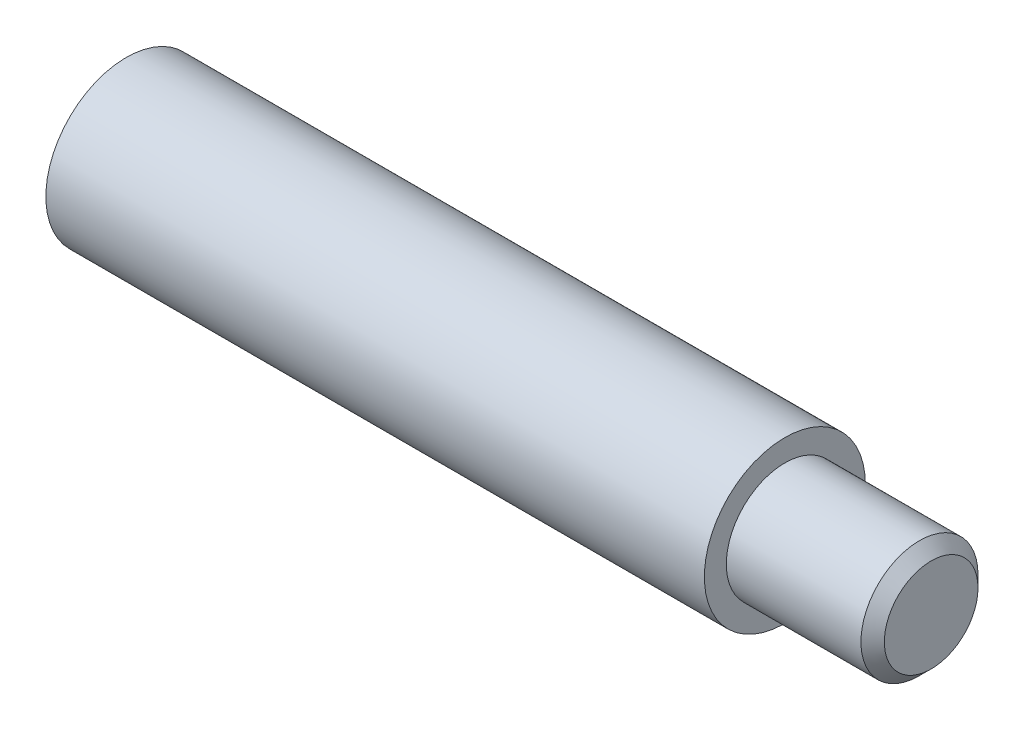
ISO-10303-21;
HEADER;
FILE_DESCRIPTION(('STEP AP214'),'2;1');
FILE_NAME('part.step','',(''),(''),'','','');
FILE_SCHEMA(('AUTOMOTIVE_DESIGN { 1 0 10303 214 1 1 1 1 }'));
ENDSEC;
DATA;
#1=APPLICATION_CONTEXT('core data for automotive mechanical design processes');
#2=APPLICATION_PROTOCOL_DEFINITION('international standard','automotive_design',2000,#1);
#3=PRODUCT_CONTEXT('',#1,'mechanical');
#4=PRODUCT('Part','Part','',(#3));
#5=PRODUCT_RELATED_PRODUCT_CATEGORY('part','',(#4));
#6=PRODUCT_DEFINITION_FORMATION('','',#4);
#7=PRODUCT_DEFINITION_CONTEXT('part definition',#1,'design');
#8=PRODUCT_DEFINITION('design','',#6,#7);
#9=PRODUCT_DEFINITION_SHAPE('','',#8);
#10=(LENGTH_UNIT() NAMED_UNIT(*) SI_UNIT(.MILLI.,.METRE.));
#11=(NAMED_UNIT(*) PLANE_ANGLE_UNIT() SI_UNIT($,.RADIAN.));
#12=(NAMED_UNIT(*) SI_UNIT($,.STERADIAN.) SOLID_ANGLE_UNIT());
#13=UNCERTAINTY_MEASURE_WITH_UNIT(LENGTH_MEASURE(1.E-05),#10,'distance_accuracy_value','');
#14=(GEOMETRIC_REPRESENTATION_CONTEXT(3) GLOBAL_UNCERTAINTY_ASSIGNED_CONTEXT((#13)) GLOBAL_UNIT_ASSIGNED_CONTEXT((#10,
#11,#12)) REPRESENTATION_CONTEXT('',''));
#15=CARTESIAN_POINT('',(0.,0.,0.));
#16=DIRECTION('',(0.,0.,1.));
#17=DIRECTION('',(1.,0.,0.));
#18=AXIS2_PLACEMENT_3D('',#15,#16,#17);
#19=CARTESIAN_POINT('',(-27.5,0.,0.));
#20=DIRECTION('',(1.,0.,0.));
#21=DIRECTION('',(0.,0.,-1.));
#22=AXIS2_PLACEMENT_3D('',#19,#20,#21);
#23=CYLINDRICAL_SURFACE('',#22,2.4585);
#24=CARTESIAN_POINT('',(-15.5,0.,0.));
#25=DIRECTION('',(1.,0.,0.));
#26=DIRECTION('',(0.,0.,-1.));
#27=AXIS2_PLACEMENT_3D('',#24,#25,#26);
#28=CIRCLE('',#27,2.4585);
#29=CARTESIAN_POINT('',(-15.5,0.,-2.4585));
#30=VERTEX_POINT('',#29);
#31=EDGE_CURVE('E11',#30,#30,#28,.T.);
#32=ORIENTED_EDGE('',*,*,#31,.T.);
#33=EDGE_LOOP('',(#32));
#34=FACE_BOUND('',#33,.T.);
#35=CARTESIAN_POINT('',(-26.7,0.,0.));
#36=DIRECTION('',(1.,0.,0.));
#37=DIRECTION('',(0.,0.,-1.));
#38=AXIS2_PLACEMENT_3D('',#35,#36,#37);
#39=CIRCLE('',#38,2.4585);
#40=CARTESIAN_POINT('',(-26.7,0.,-2.4585));
#41=VERTEX_POINT('',#40);
#42=EDGE_CURVE('E53',#41,#41,#39,.T.);
#43=ORIENTED_EDGE('',*,*,#42,.F.);
#44=EDGE_LOOP('',(#43));
#45=FACE_BOUND('',#44,.T.);
#46=ADVANCED_FACE('F34',(#34,#45),#23,.F.);
#47=CARTESIAN_POINT('',(-15.5,0.,0.));
#48=DIRECTION('',(-1.,0.,0.));
#49=DIRECTION('',(0.,0.,1.));
#50=AXIS2_PLACEMENT_3D('',#47,#48,#49);
#51=CONICAL_SURFACE('',#50,2.4585,1.02974425864057);
#52=CARTESIAN_POINT('',(-14.022784168,0.,0.));
#53=VERTEX_POINT('',#52);
#54=VERTEX_LOOP('',#53);
#55=FACE_BOUND('',#54,.T.);
#56=ORIENTED_EDGE('',*,*,#31,.F.);
#57=EDGE_LOOP('',(#56));
#58=FACE_BOUND('',#57,.T.);
#59=ADVANCED_FACE('F43',(#55,#58),#51,.F.);
#60=CARTESIAN_POINT('',(27.5,0.,0.));
#61=DIRECTION('',(1.,0.,0.));
#62=DIRECTION('',(0.,0.,-1.));
#63=AXIS2_PLACEMENT_3D('',#60,#61,#62);
#64=PLANE('',#63);
#65=CARTESIAN_POINT('',(27.5,0.,0.));
#66=DIRECTION('',(1.,0.,0.));
#67=DIRECTION('',(0.,0.,-1.));
#68=AXIS2_PLACEMENT_3D('',#65,#66,#67);
#69=CIRCLE('',#68,3.2);
#70=CARTESIAN_POINT('',(27.5,0.,-3.2));
#71=VERTEX_POINT('',#70);
#72=EDGE_CURVE('E40',#71,#71,#69,.T.);
#73=ORIENTED_EDGE('',*,*,#72,.T.);
#74=EDGE_LOOP('',(#73));
#75=FACE_BOUND('',#74,.T.);
#76=ADVANCED_FACE('F46',(#75),#64,.T.);
#77=CARTESIAN_POINT('',(27.5,0.,0.));
#78=DIRECTION('',(-1.,0.,0.));
#79=DIRECTION('',(0.,0.,1.));
#80=AXIS2_PLACEMENT_3D('',#77,#78,#79);
#81=CONICAL_SURFACE('',#80,3.2,0.785398163397451);
#82=CARTESIAN_POINT('',(26.7,0.,0.));
#83=DIRECTION('',(1.,0.,0.));
#84=DIRECTION('',(0.,0.,-1.));
#85=AXIS2_PLACEMENT_3D('',#82,#83,#84);
#86=CIRCLE('',#85,4.);
#87=CARTESIAN_POINT('',(26.7,0.,-4.));
#88=VERTEX_POINT('',#87);
#89=EDGE_CURVE('E69',#88,#88,#86,.T.);
#90=ORIENTED_EDGE('',*,*,#89,.T.);
#91=EDGE_LOOP('',(#90));
#92=FACE_BOUND('',#91,.T.);
#93=ORIENTED_EDGE('',*,*,#72,.F.);
#94=EDGE_LOOP('',(#93));
#95=FACE_BOUND('',#94,.T.);
#96=ADVANCED_FACE('F75',(#92,#95),#81,.T.);
#97=CARTESIAN_POINT('',(-27.5,0.,0.));
#98=DIRECTION('',(1.,0.,0.));
#99=DIRECTION('',(0.,0.,-1.));
#100=AXIS2_PLACEMENT_3D('',#97,#98,#99);
#101=CYLINDRICAL_SURFACE('',#100,4.);
#102=CARTESIAN_POINT('',(17.5,0.,0.));
#103=DIRECTION('',(1.,0.,0.));
#104=DIRECTION('',(0.,0.,-1.));
#105=AXIS2_PLACEMENT_3D('',#102,#103,#104);
#106=CIRCLE('',#105,4.);
#107=CARTESIAN_POINT('',(17.5,0.,-4.));
#108=VERTEX_POINT('',#107);
#109=EDGE_CURVE('E66',#108,#108,#106,.T.);
#110=ORIENTED_EDGE('',*,*,#109,.T.);
#111=EDGE_LOOP('',(#110));
#112=FACE_BOUND('',#111,.T.);
#113=ORIENTED_EDGE('',*,*,#89,.F.);
#114=EDGE_LOOP('',(#113));
#115=FACE_BOUND('',#114,.T.);
#116=ADVANCED_FACE('F77',(#112,#115),#101,.T.);
#117=CARTESIAN_POINT('',(17.5,4.,0.));
#118=DIRECTION('',(1.,0.,0.));
#119=DIRECTION('',(0.,0.,-1.));
#120=AXIS2_PLACEMENT_3D('',#117,#118,#119);
#121=PLANE('',#120);
#122=CARTESIAN_POINT('',(17.5,0.,0.));
#123=DIRECTION('',(1.,0.,0.));
#124=DIRECTION('',(0.,0.,-1.));
#125=AXIS2_PLACEMENT_3D('',#122,#123,#124);
#126=CIRCLE('',#125,5.5);
#127=CARTESIAN_POINT('',(17.5,0.,-5.5));
#128=VERTEX_POINT('',#127);
#129=EDGE_CURVE('E63',#128,#128,#126,.T.);
#130=ORIENTED_EDGE('',*,*,#129,.T.);
#131=EDGE_LOOP('',(#130));
#132=FACE_BOUND('',#131,.T.);
#133=ORIENTED_EDGE('',*,*,#109,.F.);
#134=EDGE_LOOP('',(#133));
#135=FACE_BOUND('',#134,.T.);
#136=ADVANCED_FACE('F84',(#132,#135),#121,.T.);
#137=CARTESIAN_POINT('',(-27.5,0.,0.));
#138=DIRECTION('',(1.,0.,0.));
#139=DIRECTION('',(0.,0.,-1.));
#140=AXIS2_PLACEMENT_3D('',#137,#138,#139);
#141=CYLINDRICAL_SURFACE('',#140,5.5);
#142=CARTESIAN_POINT('',(-27.5,0.,0.));
#143=DIRECTION('',(1.,0.,0.));
#144=DIRECTION('',(0.,0.,-1.));
#145=AXIS2_PLACEMENT_3D('',#142,#143,#144);
#146=CIRCLE('',#145,5.5);
#147=CARTESIAN_POINT('',(-27.5,0.,-5.5));
#148=VERTEX_POINT('',#147);
#149=EDGE_CURVE('E58',#148,#148,#146,.T.);
#150=ORIENTED_EDGE('',*,*,#149,.T.);
#151=EDGE_LOOP('',(#150));
#152=FACE_BOUND('',#151,.T.);
#153=ORIENTED_EDGE('',*,*,#129,.F.);
#154=EDGE_LOOP('',(#153));
#155=FACE_BOUND('',#154,.T.);
#156=ADVANCED_FACE('F91',(#152,#155),#141,.T.);
#157=CARTESIAN_POINT('',(-27.5,5.5,0.));
#158=DIRECTION('',(-1.,0.,0.));
#159=DIRECTION('',(0.,0.,1.));
#160=AXIS2_PLACEMENT_3D('',#157,#158,#159);
#161=PLANE('',#160);
#162=CARTESIAN_POINT('',(-27.5,0.,0.));
#163=DIRECTION('',(1.,0.,0.));
#164=DIRECTION('',(0.,0.,-1.));
#165=AXIS2_PLACEMENT_3D('',#162,#163,#164);
#166=CIRCLE('',#165,3.25849999999997);
#167=CARTESIAN_POINT('',(-27.5,0.,-3.25849999999997));
#168=VERTEX_POINT('',#167);
#169=EDGE_CURVE('E55',#168,#168,#166,.T.);
#170=ORIENTED_EDGE('',*,*,#169,.T.);
#171=EDGE_LOOP('',(#170));
#172=FACE_BOUND('',#171,.T.);
#173=ORIENTED_EDGE('',*,*,#149,.F.);
#174=EDGE_LOOP('',(#173));
#175=FACE_BOUND('',#174,.T.);
#176=ADVANCED_FACE('F95',(#172,#175),#161,.T.);
#177=CARTESIAN_POINT('',(-27.5,0.,0.));
#178=DIRECTION('',(-1.,0.,0.));
#179=DIRECTION('',(0.,0.,1.));
#180=AXIS2_PLACEMENT_3D('',#177,#178,#179);
#181=CONICAL_SURFACE('',#180,3.25849999999997,0.78539816339745);
#182=ORIENTED_EDGE('',*,*,#42,.T.);
#183=EDGE_LOOP('',(#182));
#184=FACE_BOUND('',#183,.T.);
#185=ORIENTED_EDGE('',*,*,#169,.F.);
#186=EDGE_LOOP('',(#185));
#187=FACE_BOUND('',#186,.T.);
#188=ADVANCED_FACE('F99',(#184,#187),#181,.F.);
#189=CLOSED_SHELL('',(#46,#59,#76,#96,#116,#136,#156,#176,#188));
#190=MANIFOLD_SOLID_BREP('B2',#189);
#191=ADVANCED_BREP_SHAPE_REPRESENTATION('',(#18,#190),#14);
#192=SHAPE_DEFINITION_REPRESENTATION(#9,#191);
ENDSEC;
END-ISO-10303-21;
